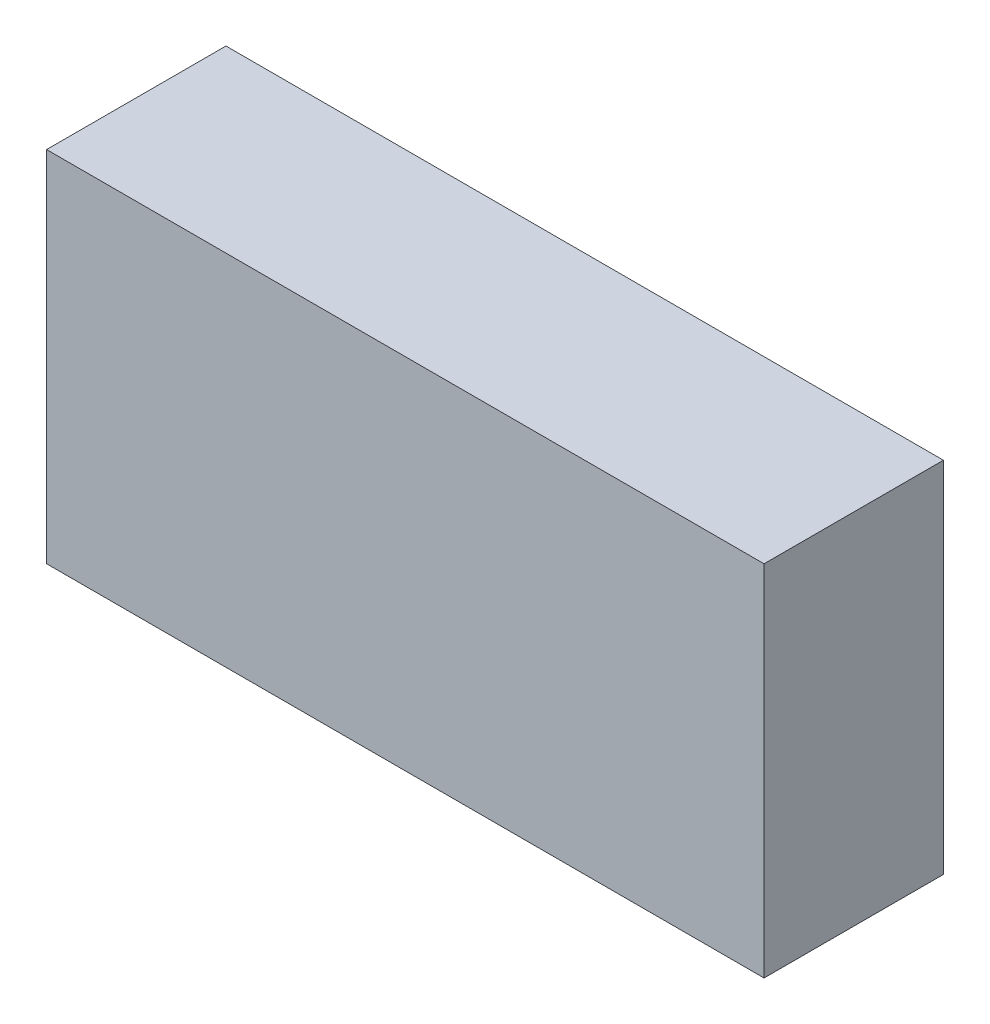
ISO-10303-21;
HEADER;
FILE_DESCRIPTION(('STEP AP214'),'2;1');
FILE_NAME('part.step','',(''),(''),'','','');
FILE_SCHEMA(('AUTOMOTIVE_DESIGN { 1 0 10303 214 1 1 1 1 }'));
ENDSEC;
DATA;
#1=APPLICATION_CONTEXT('core data for automotive mechanical design processes');
#2=APPLICATION_PROTOCOL_DEFINITION('international standard','automotive_design',2000,#1);
#3=PRODUCT_CONTEXT('',#1,'mechanical');
#4=PRODUCT('Part','Part','',(#3));
#5=PRODUCT_RELATED_PRODUCT_CATEGORY('part','',(#4));
#6=PRODUCT_DEFINITION_FORMATION('','',#4);
#7=PRODUCT_DEFINITION_CONTEXT('part definition',#1,'design');
#8=PRODUCT_DEFINITION('design','',#6,#7);
#9=PRODUCT_DEFINITION_SHAPE('','',#8);
#10=(LENGTH_UNIT() NAMED_UNIT(*) SI_UNIT(.MILLI.,.METRE.));
#11=(NAMED_UNIT(*) PLANE_ANGLE_UNIT() SI_UNIT($,.RADIAN.));
#12=(NAMED_UNIT(*) SI_UNIT($,.STERADIAN.) SOLID_ANGLE_UNIT());
#13=UNCERTAINTY_MEASURE_WITH_UNIT(LENGTH_MEASURE(1.E-05),#10,'distance_accuracy_value','');
#14=(GEOMETRIC_REPRESENTATION_CONTEXT(3) GLOBAL_UNCERTAINTY_ASSIGNED_CONTEXT((#13)) GLOBAL_UNIT_ASSIGNED_CONTEXT((#10,
#11,#12)) REPRESENTATION_CONTEXT('',''));
#15=CARTESIAN_POINT('',(0.,0.,0.));
#16=DIRECTION('',(0.,0.,1.));
#17=DIRECTION('',(1.,0.,0.));
#18=AXIS2_PLACEMENT_3D('',#15,#16,#17);
#19=CARTESIAN_POINT('',(0.,0.,50.));
#20=DIRECTION('',(1.,0.,0.));
#21=DIRECTION('',(0.,0.,-1.));
#22=AXIS2_PLACEMENT_3D('',#19,#20,#21);
#23=PLANE('',#22);
#24=DIRECTION('',(0.,-1.,0.));
#25=VECTOR('',#24,1.);
#26=CARTESIAN_POINT('',(0.,0.,0.));
#27=LINE('',#26,#25);
#28=CARTESIAN_POINT('',(0.,100.,0.));
#29=VERTEX_POINT('',#28);
#30=CARTESIAN_POINT('',(0.,0.,0.));
#31=VERTEX_POINT('',#30);
#32=EDGE_CURVE('E96',#29,#31,#27,.T.);
#33=ORIENTED_EDGE('',*,*,#32,.T.);
#34=DIRECTION('',(0.,0.,-1.));
#35=VECTOR('',#34,1.);
#36=CARTESIAN_POINT('',(0.,0.,50.));
#37=LINE('',#36,#35);
#38=CARTESIAN_POINT('',(0.,0.,50.));
#39=VERTEX_POINT('',#38);
#40=EDGE_CURVE('E11',#39,#31,#37,.T.);
#41=ORIENTED_EDGE('',*,*,#40,.F.);
#42=DIRECTION('',(0.,-1.,0.));
#43=VECTOR('',#42,1.);
#44=CARTESIAN_POINT('',(0.,0.,50.));
#45=LINE('',#44,#43);
#46=CARTESIAN_POINT('',(0.,100.,50.));
#47=VERTEX_POINT('',#46);
#48=EDGE_CURVE('E84',#47,#39,#45,.T.);
#49=ORIENTED_EDGE('',*,*,#48,.F.);
#50=DIRECTION('',(0.,0.,-1.));
#51=VECTOR('',#50,1.);
#52=CARTESIAN_POINT('',(0.,100.,50.));
#53=LINE('',#52,#51);
#54=EDGE_CURVE('E92',#47,#29,#53,.T.);
#55=ORIENTED_EDGE('',*,*,#54,.T.);
#56=EDGE_LOOP('',(#33,#41,#49,#55));
#57=FACE_BOUND('',#56,.T.);
#58=ADVANCED_FACE('F33',(#57),#23,.F.);
#59=CARTESIAN_POINT('',(0.,0.,50.));
#60=DIRECTION('',(0.,1.,0.));
#61=DIRECTION('',(0.,0.,1.));
#62=AXIS2_PLACEMENT_3D('',#59,#60,#61);
#63=PLANE('',#62);
#64=DIRECTION('',(1.,0.,0.));
#65=VECTOR('',#64,1.);
#66=CARTESIAN_POINT('',(0.,0.,0.));
#67=LINE('',#66,#65);
#68=CARTESIAN_POINT('',(200.,0.,0.));
#69=VERTEX_POINT('',#68);
#70=EDGE_CURVE('E88',#31,#69,#67,.T.);
#71=ORIENTED_EDGE('',*,*,#70,.T.);
#72=DIRECTION('',(0.,0.,-1.));
#73=VECTOR('',#72,1.);
#74=CARTESIAN_POINT('',(200.,0.,50.));
#75=LINE('',#74,#73);
#76=CARTESIAN_POINT('',(200.,0.,50.));
#77=VERTEX_POINT('',#76);
#78=EDGE_CURVE('E41',#77,#69,#75,.T.);
#79=ORIENTED_EDGE('',*,*,#78,.F.);
#80=DIRECTION('',(1.,0.,0.));
#81=VECTOR('',#80,1.);
#82=CARTESIAN_POINT('',(0.,0.,50.));
#83=LINE('',#82,#81);
#84=EDGE_CURVE('E79',#39,#77,#83,.T.);
#85=ORIENTED_EDGE('',*,*,#84,.F.);
#86=ORIENTED_EDGE('',*,*,#40,.T.);
#87=EDGE_LOOP('',(#71,#79,#85,#86));
#88=FACE_BOUND('',#87,.T.);
#89=ADVANCED_FACE('F87',(#88),#63,.F.);
#90=CARTESIAN_POINT('',(200.,0.,50.));
#91=DIRECTION('',(-1.,0.,0.));
#92=DIRECTION('',(0.,0.,1.));
#93=AXIS2_PLACEMENT_3D('',#90,#91,#92);
#94=PLANE('',#93);
#95=DIRECTION('',(0.,1.,0.));
#96=VECTOR('',#95,1.);
#97=CARTESIAN_POINT('',(200.,0.,0.));
#98=LINE('',#97,#96);
#99=CARTESIAN_POINT('',(200.,100.,0.));
#100=VERTEX_POINT('',#99);
#101=EDGE_CURVE('E66',#69,#100,#98,.T.);
#102=ORIENTED_EDGE('',*,*,#101,.T.);
#103=DIRECTION('',(0.,0.,-1.));
#104=VECTOR('',#103,1.);
#105=CARTESIAN_POINT('',(200.,100.,50.));
#106=LINE('',#105,#104);
#107=CARTESIAN_POINT('',(200.,100.,50.));
#108=VERTEX_POINT('',#107);
#109=EDGE_CURVE('E89',#108,#100,#106,.T.);
#110=ORIENTED_EDGE('',*,*,#109,.F.);
#111=DIRECTION('',(0.,1.,0.));
#112=VECTOR('',#111,1.);
#113=CARTESIAN_POINT('',(200.,0.,50.));
#114=LINE('',#113,#112);
#115=EDGE_CURVE('E82',#77,#108,#114,.T.);
#116=ORIENTED_EDGE('',*,*,#115,.F.);
#117=ORIENTED_EDGE('',*,*,#78,.T.);
#118=EDGE_LOOP('',(#102,#110,#116,#117));
#119=FACE_BOUND('',#118,.T.);
#120=ADVANCED_FACE('F90',(#119),#94,.F.);
#121=CARTESIAN_POINT('',(0.,100.,50.));
#122=DIRECTION('',(0.,-1.,0.));
#123=DIRECTION('',(0.,0.,-1.));
#124=AXIS2_PLACEMENT_3D('',#121,#122,#123);
#125=PLANE('',#124);
#126=DIRECTION('',(-1.,0.,0.));
#127=VECTOR('',#126,1.);
#128=CARTESIAN_POINT('',(0.,100.,0.));
#129=LINE('',#128,#127);
#130=EDGE_CURVE('E72',#100,#29,#129,.T.);
#131=ORIENTED_EDGE('',*,*,#130,.T.);
#132=ORIENTED_EDGE('',*,*,#54,.F.);
#133=DIRECTION('',(-1.,0.,0.));
#134=VECTOR('',#133,1.);
#135=CARTESIAN_POINT('',(0.,100.,50.));
#136=LINE('',#135,#134);
#137=EDGE_CURVE('E49',#108,#47,#136,.T.);
#138=ORIENTED_EDGE('',*,*,#137,.F.);
#139=ORIENTED_EDGE('',*,*,#109,.T.);
#140=EDGE_LOOP('',(#131,#132,#138,#139));
#141=FACE_BOUND('',#140,.T.);
#142=ADVANCED_FACE('F103',(#141),#125,.F.);
#143=CARTESIAN_POINT('',(0.,0.,50.));
#144=DIRECTION('',(0.,0.,-1.));
#145=DIRECTION('',(-1.,0.,0.));
#146=AXIS2_PLACEMENT_3D('',#143,#144,#145);
#147=PLANE('',#146);
#148=ORIENTED_EDGE('',*,*,#48,.T.);
#149=ORIENTED_EDGE('',*,*,#84,.T.);
#150=ORIENTED_EDGE('',*,*,#115,.T.);
#151=ORIENTED_EDGE('',*,*,#137,.T.);
#152=EDGE_LOOP('',(#148,#149,#150,#151));
#153=FACE_BOUND('',#152,.T.);
#154=ADVANCED_FACE('F80',(#153),#147,.F.);
#155=CARTESIAN_POINT('',(0.,0.,0.));
#156=DIRECTION('',(0.,0.,-1.));
#157=DIRECTION('',(-1.,0.,0.));
#158=AXIS2_PLACEMENT_3D('',#155,#156,#157);
#159=PLANE('',#158);
#160=ORIENTED_EDGE('',*,*,#32,.F.);
#161=ORIENTED_EDGE('',*,*,#130,.F.);
#162=ORIENTED_EDGE('',*,*,#101,.F.);
#163=ORIENTED_EDGE('',*,*,#70,.F.);
#164=EDGE_LOOP('',(#160,#161,#162,#163));
#165=FACE_BOUND('',#164,.T.);
#166=ADVANCED_FACE('F106',(#165),#159,.T.);
#167=CLOSED_SHELL('',(#58,#89,#120,#142,#154,#166));
#168=MANIFOLD_SOLID_BREP('B2',#167);
#169=ADVANCED_BREP_SHAPE_REPRESENTATION('',(#18,#168),#14);
#170=SHAPE_DEFINITION_REPRESENTATION(#9,#169);
ENDSEC;
END-ISO-10303-21;
